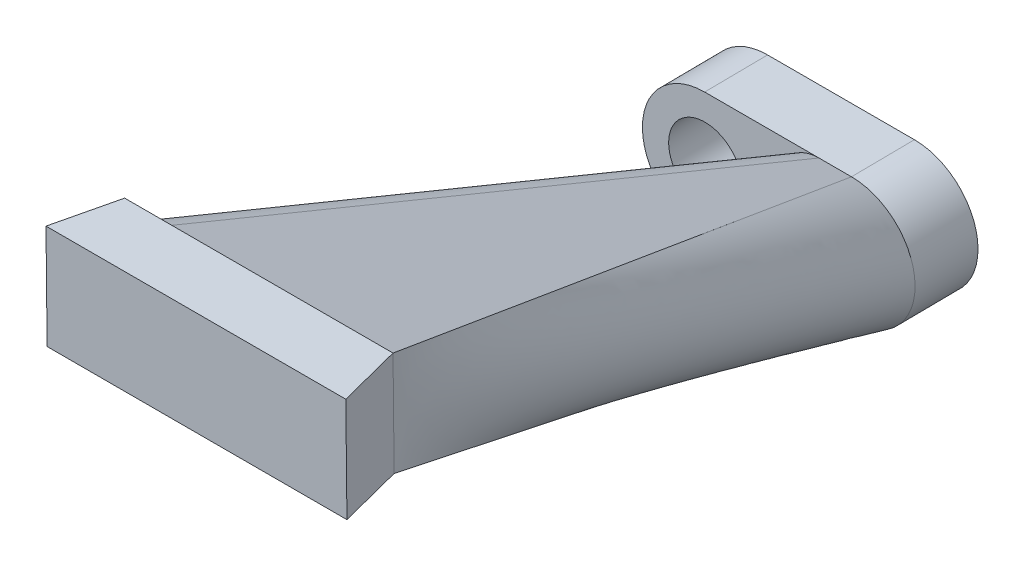
ISO-10303-21;
HEADER;
FILE_DESCRIPTION(('STEP AP214'),'2;1');
FILE_NAME('part.step','',(''),(''),'','','');
FILE_SCHEMA(('AUTOMOTIVE_DESIGN { 1 0 10303 214 1 1 1 1 }'));
ENDSEC;
DATA;
#1=APPLICATION_CONTEXT('core data for automotive mechanical design processes');
#2=APPLICATION_PROTOCOL_DEFINITION('international standard','automotive_design',2000,#1);
#3=PRODUCT_CONTEXT('',#1,'mechanical');
#4=PRODUCT('Part','Part','',(#3));
#5=PRODUCT_RELATED_PRODUCT_CATEGORY('part','',(#4));
#6=PRODUCT_DEFINITION_FORMATION('','',#4);
#7=PRODUCT_DEFINITION_CONTEXT('part definition',#1,'design');
#8=PRODUCT_DEFINITION('design','',#6,#7);
#9=PRODUCT_DEFINITION_SHAPE('','',#8);
#10=(LENGTH_UNIT() NAMED_UNIT(*) SI_UNIT(.MILLI.,.METRE.));
#11=(NAMED_UNIT(*) PLANE_ANGLE_UNIT() SI_UNIT($,.RADIAN.));
#12=(NAMED_UNIT(*) SI_UNIT($,.STERADIAN.) SOLID_ANGLE_UNIT());
#13=UNCERTAINTY_MEASURE_WITH_UNIT(LENGTH_MEASURE(1.E-05),#10,'distance_accuracy_value','');
#14=(GEOMETRIC_REPRESENTATION_CONTEXT(3) GLOBAL_UNCERTAINTY_ASSIGNED_CONTEXT((#13)) GLOBAL_UNIT_ASSIGNED_CONTEXT((#10,
#11,#12)) REPRESENTATION_CONTEXT('',''));
#15=CARTESIAN_POINT('',(0.,0.,0.));
#16=DIRECTION('',(0.,0.,1.));
#17=DIRECTION('',(1.,0.,0.));
#18=AXIS2_PLACEMENT_3D('',#15,#16,#17);
#19=CARTESIAN_POINT('',(83.3410313790949,-3.38593298130903,-20.8732078604044));
#20=DIRECTION('',(-0.970139338542733,-0.002552998259323,0.24253483463568));
#21=DIRECTION('',(0.24253562503633,0.,0.970142500145333));
#22=AXIS2_PLACEMENT_3D('',#19,#20,#21);
#23=PLANE('',#22);
#24=DIRECTION('',(0.242548271096433,-0.0102114273229164,0.970085595677083));
#25=VECTOR('',#24,1.);
#26=CARTESIAN_POINT('',(83.3410313790949,1.61379003339868,-20.8205791970917));
#27=LINE('',#26,#25);
#28=CARTESIAN_POINT('',(109.497742940186,0.512576827857516,83.7946753293208));
#29=VERTEX_POINT('',#28);
#30=CARTESIAN_POINT('',(110.247784490282,0.480999629869888,86.7945091381455));
#31=VERTEX_POINT('',#30);
#32=EDGE_CURVE('E200',#29,#31,#27,.T.);
#33=ORIENTED_EDGE('',*,*,#32,.T.);
#34=DIRECTION('',(0.,0.999944602941541,0.0105257326625423));
#35=VECTOR('',#34,1.);
#36=CARTESIAN_POINT('',(110.247784490282,-4.51872338483782,86.7418804748328));
#37=LINE('',#36,#35);
#38=CARTESIAN_POINT('',(110.247784490282,-4.51872338483782,86.7418804748328));
#39=VERTEX_POINT('',#38);
#40=EDGE_CURVE('E196',#39,#31,#37,.T.);
#41=ORIENTED_EDGE('',*,*,#40,.F.);
#42=DIRECTION('',(0.242548271096433,-0.0102114273229164,0.970085595677083));
#43=VECTOR('',#42,1.);
#44=CARTESIAN_POINT('',(83.3410313790949,-3.38593298130903,-20.8732078604044));
#45=LINE('',#44,#43);
#46=CARTESIAN_POINT('',(109.497742940186,-4.48714618685019,83.7420466660081));
#47=VERTEX_POINT('',#46);
#48=EDGE_CURVE('E397',#47,#39,#45,.T.);
#49=ORIENTED_EDGE('',*,*,#48,.F.);
#50=DIRECTION('',(0.,0.999944602941541,0.0105257326625419));
#51=VECTOR('',#50,1.);
#52=CARTESIAN_POINT('',(109.497742940186,-4.48714618685019,83.7420466660081));
#53=LINE('',#52,#51);
#54=EDGE_CURVE('E395',#47,#29,#53,.T.);
#55=ORIENTED_EDGE('',*,*,#54,.T.);
#56=EDGE_LOOP('',(#33,#41,#49,#55));
#57=FACE_BOUND('',#56,.T.);
#58=ADVANCED_FACE('F91',(#57),#23,.F.);
#59=CARTESIAN_POINT('',(0.,-4.51872338483783,86.7418804748327));
#60=DIRECTION('',(0.,0.0105257326625423,-0.999944602941541));
#61=DIRECTION('',(0.,0.999944602941541,0.0105257326625423));
#62=AXIS2_PLACEMENT_3D('',#59,#60,#61);
#63=PLANE('',#62);
#64=DIRECTION('',(-1.,0.,0.));
#65=VECTOR('',#64,1.);
#66=CARTESIAN_POINT('',(0.,0.480999629869876,86.7945091381454));
#67=LINE('',#66,#65);
#68=CARTESIAN_POINT('',(95.9522155097186,0.480999629869887,86.7945091381455));
#69=VERTEX_POINT('',#68);
#70=EDGE_CURVE('E189',#31,#69,#67,.T.);
#71=ORIENTED_EDGE('',*,*,#70,.T.);
#72=DIRECTION('',(0.,0.999944602941541,0.0105257326625419));
#73=VECTOR('',#72,1.);
#74=CARTESIAN_POINT('',(95.9522155097186,-4.51872338483782,86.7418804748328));
#75=LINE('',#74,#73);
#76=CARTESIAN_POINT('',(95.9522155097186,-4.51872338483782,86.7418804748328));
#77=VERTEX_POINT('',#76);
#78=EDGE_CURVE('E194',#77,#69,#75,.T.);
#79=ORIENTED_EDGE('',*,*,#78,.F.);
#80=DIRECTION('',(-1.,0.,0.));
#81=VECTOR('',#80,1.);
#82=CARTESIAN_POINT('',(0.,-4.51872338483783,86.7418804748327));
#83=LINE('',#82,#81);
#84=EDGE_CURVE('E393',#39,#77,#83,.T.);
#85=ORIENTED_EDGE('',*,*,#84,.F.);
#86=ORIENTED_EDGE('',*,*,#40,.T.);
#87=EDGE_LOOP('',(#71,#79,#85,#86));
#88=FACE_BOUND('',#87,.T.);
#89=ADVANCED_FACE('F191',(#88),#63,.F.);
#90=CARTESIAN_POINT('',(0.,-3.60525148493823,-0.037950015630928));
#91=DIRECTION('',(0.,-0.999944602941541,-0.0105257326625423));
#92=DIRECTION('',(0.,0.0105257326625423,-0.999944602941541));
#93=AXIS2_PLACEMENT_3D('',#90,#91,#92);
#94=PLANE('',#93);
#95=DIRECTION('',(1.,0.,0.));
#96=VECTOR('',#95,1.);
#97=CARTESIAN_POINT('',(99.4479935520343,-4.48714618685019,83.7420466660082));
#98=LINE('',#97,#96);
#99=CARTESIAN_POINT('',(99.0747814196377,-4.48714618685019,83.7420466660082));
#100=VERTEX_POINT('',#99);
#101=EDGE_CURVE('E199',#47,#100,#98,.F.);
#102=ORIENTED_EDGE('',*,*,#101,.F.);
#103=ORIENTED_EDGE('',*,*,#48,.T.);
#104=ORIENTED_EDGE('',*,*,#84,.T.);
#105=DIRECTION('',(-0.242548271096444,-0.0102114273229171,0.97008559567708));
#106=VECTOR('',#105,1.);
#107=CARTESIAN_POINT('',(96.7022570598142,-4.48714618685019,83.7420466660082));
#108=LINE('',#107,#106);
#109=CARTESIAN_POINT('',(96.7022570598142,-4.48714618685019,83.7420466660082));
#110=VERTEX_POINT('',#109);
#111=EDGE_CURVE('E213',#110,#77,#108,.T.);
#112=ORIENTED_EDGE('',*,*,#111,.F.);
#113=DIRECTION('',(1.,0.,0.));
#114=VECTOR('',#113,1.);
#115=CARTESIAN_POINT('',(96.7022570598142,-4.48714618685019,83.7420466660082));
#116=LINE('',#115,#114);
#117=EDGE_CURVE('E109',#110,#100,#116,.T.);
#118=ORIENTED_EDGE('',*,*,#117,.T.);
#119=EDGE_LOOP('',(#102,#103,#104,#112,#118));
#120=FACE_BOUND('',#119,.T.);
#121=ADVANCED_FACE('F354',(#120),#94,.T.);
#122=CARTESIAN_POINT('',(0.,1.39447152976948,0.0146786476817837));
#123=DIRECTION('',(0.,-0.999944602941541,-0.0105257326625423));
#124=DIRECTION('',(0.,0.0105257326625423,-0.999944602941541));
#125=AXIS2_PLACEMENT_3D('',#122,#123,#124);
#126=PLANE('',#125);
#127=DIRECTION('',(1.,0.,0.));
#128=VECTOR('',#127,1.);
#129=CARTESIAN_POINT('',(0.,0.512576827857503,83.7946753293208));
#130=LINE('',#129,#128);
#131=CARTESIAN_POINT('',(98.9495876002193,0.512576827857514,83.7946753293208));
#132=VERTEX_POINT('',#131);
#133=EDGE_CURVE('E404',#29,#132,#130,.F.);
#134=ORIENTED_EDGE('',*,*,#133,.T.);
#135=DIRECTION('',(1.,0.,0.));
#136=VECTOR('',#135,1.);
#137=CARTESIAN_POINT('',(96.7022570598142,0.512576827857512,83.7946753293209));
#138=LINE('',#137,#136);
#139=CARTESIAN_POINT('',(96.7022570598142,0.512576827857512,83.7946753293209));
#140=VERTEX_POINT('',#139);
#141=EDGE_CURVE('E206',#140,#132,#138,.T.);
#142=ORIENTED_EDGE('',*,*,#141,.F.);
#143=DIRECTION('',(0.242548271096444,0.0102114273229158,-0.97008559567708));
#144=VECTOR('',#143,1.);
#145=CARTESIAN_POINT('',(95.9522155097186,0.480999629869887,86.7945091381455));
#146=LINE('',#145,#144);
#147=EDGE_CURVE('E203',#69,#140,#146,.T.);
#148=ORIENTED_EDGE('',*,*,#147,.F.);
#149=ORIENTED_EDGE('',*,*,#70,.F.);
#150=ORIENTED_EDGE('',*,*,#32,.F.);
#151=EDGE_LOOP('',(#134,#142,#148,#149,#150));
#152=FACE_BOUND('',#151,.T.);
#153=ADVANCED_FACE('F205',(#152),#126,.F.);
#154=CARTESIAN_POINT('',(102.947993552034,-9.68896326867873,55.3857228731185));
#155=DIRECTION('',(0.,0.941158271494262,-0.33796613439505));
#156=DIRECTION('',(-1.,0.,0.));
#157=AXIS2_PLACEMENT_3D('',#154,#155,#156);
#158=PLANE('',#157);
#159=DIRECTION('',(-1.,0.,0.));
#160=VECTOR('',#159,1.);
#161=CARTESIAN_POINT('',(99.4479935520343,-9.68896326867873,55.3857228731185));
#162=LINE('',#161,#160);
#163=CARTESIAN_POINT('',(102.947993552034,-9.68896326867873,55.3857228731185));
#164=VERTEX_POINT('',#163);
#165=CARTESIAN_POINT('',(101.395324092439,-9.68896326867873,55.3857228731185));
#166=VERTEX_POINT('',#165);
#167=EDGE_CURVE('E246',#164,#166,#162,.T.);
#168=ORIENTED_EDGE('',*,*,#167,.T.);
#169=DIRECTION('',(-0.0807599787850204,0.336862194431635,0.938084051558999));
#170=VECTOR('',#169,1.);
#171=CARTESIAN_POINT('',(101.405450873089,-9.73120361598088,55.2680931812402));
#172=LINE('',#171,#170);
#173=EDGE_CURVE('E372',#166,#132,#172,.T.);
#174=ORIENTED_EDGE('',*,*,#173,.T.);
#175=ORIENTED_EDGE('',*,*,#133,.F.);
#176=CARTESIAN_POINT('',(102.947993552034,-9.68896326867873,55.3857228731185));
#177=CARTESIAN_POINT('',(105.131243348085,-6.28844990316665,64.8553736918526));
#178=CARTESIAN_POINT('',(107.314493144135,-2.88793653765457,74.3250245105867));
#179=CARTESIAN_POINT('',(109.497742940186,0.512576827857515,83.7946753293209));
#180=B_SPLINE_CURVE_WITH_KNOTS('',3,(#176,#177,#178,#179),.UNSPECIFIED.,.F.,.F.,(4,4),(0.,1.),.UNSPECIFIED.);
#181=EDGE_CURVE('E383',#164,#29,#180,.T.);
#182=ORIENTED_EDGE('',*,*,#181,.F.);
#183=EDGE_LOOP('',(#168,#174,#175,#182));
#184=FACE_BOUND('',#183,.T.);
#185=ADVANCED_FACE('F428',(#184),#158,.T.);
#186=CARTESIAN_POINT('',(102.947993552034,-15.688630886328,55.3225684771433));
#187=CARTESIAN_POINT('',(105.131243348085,-11.9548026531687,64.7957278734316));
#188=CARTESIAN_POINT('',(107.314493144135,-8.22097442000945,74.2688872697199));
#189=CARTESIAN_POINT('',(109.497742940186,-4.48714618685019,83.7420466660081));
#190=CARTESIAN_POINT('',(103.340692630599,-15.688630886328,55.3225684771433));
#191=CARTESIAN_POINT('',(105.393042733795,-11.8853620557422,64.7964588270887));
#192=CARTESIAN_POINT('',(107.44539283699,-8.08209322515646,74.2703491770341));
#193=CARTESIAN_POINT('',(109.497742940186,-4.2788243945707,83.7442395269795));
#194=CARTESIAN_POINT('',(104.125991313304,-15.5326096603819,55.3242108058375));
#195=CARTESIAN_POINT('',(105.916575188932,-11.6424667102585,64.7990156201991));
#196=CARTESIAN_POINT('',(107.707159064559,-7.75232376013513,74.2738204345606));
#197=CARTESIAN_POINT('',(109.497742940186,-3.86218081001173,83.7486252489222));
#198=CARTESIAN_POINT('',(105.124627613064,-14.8652503165816,55.3312356410353));
#199=CARTESIAN_POINT('',(106.582332722105,-10.9892386887789,64.8058917046356));
#200=CARTESIAN_POINT('',(108.040037831145,-7.11322706097606,74.2805477682359));
#201=CARTESIAN_POINT('',(109.497742940186,-3.23721543317327,83.7552038318363));
#202=CARTESIAN_POINT('',(105.79188128394,-13.866726208209,55.3417464211235));
#203=CARTESIAN_POINT('',(107.027168502688,-10.1152341575843,64.8150917523325));
#204=CARTESIAN_POINT('',(108.262455721437,-6.36374210695954,74.2884370835415));
#205=CARTESIAN_POINT('',(109.497742940186,-2.6122500563348,83.7617824147504));
#206=CARTESIAN_POINT('',(106.026205735813,-12.6887970775033,55.3541456751308));
#207=CARTESIAN_POINT('',(107.183384803937,-9.12162627816767,64.8255507826421));
#208=CARTESIAN_POINT('',(108.340563872061,-5.554455478832,74.2969558901533));
#209=CARTESIAN_POINT('',(109.497742940186,-1.98728467949634,83.7683609976646));
#210=CARTESIAN_POINT('',(105.791881283939,-11.5108679467977,55.3665449291384));
#211=CARTESIAN_POINT('',(107.027168502688,-8.12801839875108,64.8360098129518));
#212=CARTESIAN_POINT('',(108.262455721437,-4.74516885070447,74.3054746967652));
#213=CARTESIAN_POINT('',(109.497742940186,-1.36231930265787,83.7749395805786));
#214=CARTESIAN_POINT('',(105.124627613064,-10.5123438384251,55.3770557092264));
#215=CARTESIAN_POINT('',(106.582332722105,-7.25401386755651,64.8452098606484));
#216=CARTESIAN_POINT('',(108.040037831145,-3.99568389668796,74.3133640120705));
#217=CARTESIAN_POINT('',(109.497742940186,-0.737353925819412,83.7815181634926));
#218=CARTESIAN_POINT('',(104.125991313304,-9.84498449462477,55.3840805444244));
#219=CARTESIAN_POINT('',(105.916575188932,-6.60078584607683,64.8520859450852));
#220=CARTESIAN_POINT('',(107.707159064559,-3.35658719752889,74.320091345746));
#221=CARTESIAN_POINT('',(109.497742940186,-0.112388548980949,83.7880967464067));
#222=CARTESIAN_POINT('',(103.340692630599,-9.68896326867873,55.3857228731185));
#223=CARTESIAN_POINT('',(105.393042733795,-6.35789050059314,64.8546427381955));
#224=CARTESIAN_POINT('',(107.44539283699,-3.02681773250756,74.3235626032725));
#225=CARTESIAN_POINT('',(109.497742940186,0.304255035578027,83.7924824683495));
#226=CARTESIAN_POINT('',(102.947993552034,-9.68896326867873,55.3857228731185));
#227=CARTESIAN_POINT('',(105.131243348085,-6.28844990316665,64.8553736918526));
#228=CARTESIAN_POINT('',(107.314493144135,-2.88793653765457,74.3250245105867));
#229=CARTESIAN_POINT('',(109.497742940186,0.512576827857515,83.7946753293209));
#230=B_SPLINE_SURFACE_WITH_KNOTS('',3,3,((#186,#187,#188,#189),(#190,#191,#192,#193),(#194,#195,
#196,#197),(#198,#199,#200,#201),(#202,#203,#204,#205),(#206,#207,#208,#209),(#210,#211,#212,
#213),(#214,#215,#216,#217),(#218,#219,#220,#221),(#222,#223,#224,#225),(#226,#227,#228,#229)),
.UNSPECIFIED.,.F.,.F.,.F.,(4,1,1,1,1,1,1,1,4),(4,4),(0.461819265649355,0.497017897985986,
0.532216530322617,0.567415162659249,0.60261379499588,0.637812427332512,0.673011059669143,
0.708209692005775,0.743408324342406),(0.,1.),.UNSPECIFIED.);
#231=CARTESIAN_POINT('',(102.947993552034,-12.6887970775034,55.3541456751309));
#232=DIRECTION('',(0.,-0.0105257326625423,0.999944602941541));
#233=DIRECTION('',(0.,-0.999944602941541,-0.0105257326625423));
#234=AXIS2_PLACEMENT_3D('',#231,#232,#233);
#235=CIRCLE('',#234,3.);
#236=CARTESIAN_POINT('',(102.947993552034,-15.688630886328,55.3225684771433));
#237=VERTEX_POINT('',#236);
#238=EDGE_CURVE('E253',#237,#164,#235,.T.);
#239=CARTESIAN_POINT('',(102.947993552034,-15.688630886328,55.3225684771433));
#240=CARTESIAN_POINT('',(105.131243348085,-11.9548026531687,64.7957278734316));
#241=CARTESIAN_POINT('',(107.314493144135,-8.22097442000945,74.2688872697199));
#242=CARTESIAN_POINT('',(109.497742940186,-4.48714618685019,83.7420466660081));
#243=B_SPLINE_CURVE_WITH_KNOTS('',3,(#239,#240,#241,#242),.UNSPECIFIED.,.F.,.F.,(4,4),(0.,1.),.UNSPECIFIED.);
#244=EDGE_CURVE('E380',#237,#47,#243,.T.);
#245=ORIENTED_EDGE('',*,*,#238,.T.);
#246=ORIENTED_EDGE('',*,*,#181,.T.);
#247=ORIENTED_EDGE('',*,*,#54,.F.);
#248=ORIENTED_EDGE('',*,*,#244,.F.);
#249=EDGE_LOOP('',(#245,#246,#247,#248));
#250=FACE_BOUND('',#249,.T.);
#251=ADVANCED_FACE('F436',(#250),#230,.T.);
#252=CARTESIAN_POINT('',(99.4479935520343,-15.688630886328,55.3225684771433));
#253=DIRECTION('',(0.,-0.930342147653002,0.366692634641602));
#254=DIRECTION('',(1.,0.,0.));
#255=AXIS2_PLACEMENT_3D('',#252,#253,#254);
#256=PLANE('',#255);
#257=ORIENTED_EDGE('',*,*,#101,.T.);
#258=DIRECTION('',(-0.0798084254407687,0.365522965907367,0.927374561125626));
#259=VECTOR('',#258,1.);
#260=CARTESIAN_POINT('',(101.507317206762,-15.6281715945678,55.4759607791095));
#261=LINE('',#260,#259);
#262=CARTESIAN_POINT('',(101.520517911858,-15.688630886328,55.3225684771433));
#263=VERTEX_POINT('',#262);
#264=EDGE_CURVE('E303',#100,#263,#261,.F.);
#265=ORIENTED_EDGE('',*,*,#264,.T.);
#266=DIRECTION('',(1.,0.,0.));
#267=VECTOR('',#266,1.);
#268=CARTESIAN_POINT('',(99.4479935520343,-15.688630886328,55.3225684771433));
#269=LINE('',#268,#267);
#270=EDGE_CURVE('E95',#263,#237,#269,.T.);
#271=ORIENTED_EDGE('',*,*,#270,.T.);
#272=ORIENTED_EDGE('',*,*,#244,.T.);
#273=EDGE_LOOP('',(#257,#265,#271,#272));
#274=FACE_BOUND('',#273,.T.);
#275=ADVANCED_FACE('F440',(#274),#256,.T.);
#276=CARTESIAN_POINT('',(99.4479935520343,-9.68896326867873,55.3857228731185));
#277=DIRECTION('',(-0.996286426455116,0.000906274534651452,-0.0860960807921161));
#278=DIRECTION('',(0.,-0.999944602941541,-0.0105257326625414));
#279=AXIS2_PLACEMENT_3D('',#276,#277,#278);
#280=PLANE('',#279);
#281=DIRECTION('',(0.,-0.999944602941541,-0.0105257326625414));
#282=VECTOR('',#281,1.);
#283=CARTESIAN_POINT('',(97.0022570598142,-9.98684150302866,83.6841551363642));
#284=LINE('',#283,#282);
#285=CARTESIAN_POINT('',(97.0022570598141,-2.25847106274648,83.7655064041566));
#286=VERTEX_POINT('',#285);
#287=CARTESIAN_POINT('',(97.0022570598141,-1.55663975490705,83.7728941021338));
#288=VERTEX_POINT('',#287);
#289=EDGE_CURVE('E391',#286,#288,#284,.F.);
#290=ORIENTED_EDGE('',*,*,#289,.T.);
#291=DIRECTION('',(-0.0807599787850204,0.336862194431635,0.938084051558999));
#292=VECTOR('',#291,1.);
#293=CARTESIAN_POINT('',(99.3900504105716,-11.5164901670349,56.0369920568047));
#294=LINE('',#293,#292);
#295=CARTESIAN_POINT('',(99.4479935520343,-11.7581798514433,55.3639416459315));
#296=VERTEX_POINT('',#295);
#297=EDGE_CURVE('E307',#288,#296,#294,.F.);
#298=ORIENTED_EDGE('',*,*,#297,.T.);
#299=DIRECTION('',(0.,-0.999944602941541,-0.0105257326625426));
#300=VECTOR('',#299,1.);
#301=CARTESIAN_POINT('',(99.4479935520343,-9.68896326867873,55.3857228731185));
#302=LINE('',#301,#300);
#303=CARTESIAN_POINT('',(99.4479935520343,-13.4599557622243,55.3460282152917));
#304=VERTEX_POINT('',#303);
#305=EDGE_CURVE('E376',#296,#304,#302,.T.);
#306=ORIENTED_EDGE('',*,*,#305,.T.);
#307=DIRECTION('',(-0.0798084254407687,0.365522965907367,0.927374561125626));
#308=VECTOR('',#307,1.);
#309=CARTESIAN_POINT('',(99.3350489734951,-12.9426690584359,56.6584451484138));
#310=LINE('',#309,#308);
#311=EDGE_CURVE('E388',#304,#286,#310,.T.);
#312=ORIENTED_EDGE('',*,*,#311,.T.);
#313=EDGE_LOOP('',(#290,#298,#306,#312));
#314=FACE_BOUND('',#313,.T.);
#315=ADVANCED_FACE('F337',(#314),#280,.T.);
#316=CARTESIAN_POINT('',(95.9479935520343,-12.6887970775034,55.3541456751309));
#317=DIRECTION('',(0.,-0.0105257326625423,0.999944602941541));
#318=DIRECTION('',(0.,-0.999944602941541,-0.0105257326625423));
#319=AXIS2_PLACEMENT_3D('',#316,#317,#318);
#320=PLANE('',#319);
#321=DIRECTION('',(1.,0.,0.));
#322=VECTOR('',#321,1.);
#323=CARTESIAN_POINT('',(95.9479935520343,-15.688630886328,55.3225684771433));
#324=LINE('',#323,#322);
#325=CARTESIAN_POINT('',(95.9479935520343,-15.688630886328,55.3225684771433));
#326=VERTEX_POINT('',#325);
#327=CARTESIAN_POINT('',(99.4479935520343,-15.688630886328,55.3225684771433));
#328=VERTEX_POINT('',#327);
#329=EDGE_CURVE('E230',#326,#328,#324,.T.);
#330=ORIENTED_EDGE('',*,*,#329,.T.);
#331=CARTESIAN_POINT('',(99.4479935520343,-15.688630886328,55.3225684771433));
#332=DIRECTION('',(1.,0.,0.));
#333=VECTOR('',#332,1.);
#334=LINE('',#331,#333);
#335=EDGE_CURVE('E322',#328,#263,#334,.T.);
#336=ORIENTED_EDGE('',*,*,#335,.T.);
#337=CARTESIAN_POINT('',(101.455448383188,-13.52992784202,55.3452916670834));
#338=DIRECTION('',(0.,-0.0105257326625423,0.999944602941541));
#339=DIRECTION('',(-0.208020412743924,0.978070299640327,0.010295476838319));
#340=AXIS2_PLACEMENT_3D('',#337,#338,#339);
#341=ELLIPSE('',#340,2.16573084107591,2.);
#342=EDGE_CURVE('E13',#263,#304,#341,.F.);
#343=ORIENTED_EDGE('',*,*,#342,.T.);
#344=ORIENTED_EDGE('',*,*,#305,.F.);
#345=CARTESIAN_POINT('',(101.455448383188,-11.8220674025611,55.3632691453935));
#346=DIRECTION('',(0.,-0.0105257326625423,0.999944602941541));
#347=DIRECTION('',(-0.226854555639595,0.973874694802167,0.0102513125768647));
#348=AXIS2_PLACEMENT_3D('',#345,#346,#347);
#349=ELLIPSE('',#348,2.14021314709457,2.);
#350=EDGE_CURVE('E311',#296,#166,#349,.F.);
#351=ORIENTED_EDGE('',*,*,#350,.T.);
#352=DIRECTION('',(-1.,0.,0.));
#353=VECTOR('',#352,1.);
#354=CARTESIAN_POINT('',(95.9479935520343,-9.68896326867873,55.3857228731185));
#355=LINE('',#354,#353);
#356=CARTESIAN_POINT('',(95.9479935520343,-9.68896326867873,55.3857228731185));
#357=VERTEX_POINT('',#356);
#358=EDGE_CURVE('E117',#166,#357,#355,.T.);
#359=ORIENTED_EDGE('',*,*,#358,.T.);
#360=CARTESIAN_POINT('',(95.9479935520343,-12.6887970775034,55.3541456751309));
#361=DIRECTION('',(0.,-0.0105257326625423,0.999944602941541));
#362=DIRECTION('',(0.,-0.999944602941541,-0.0105257326625423));
#363=AXIS2_PLACEMENT_3D('',#360,#361,#362);
#364=CIRCLE('',#363,3.);
#365=EDGE_CURVE('E227',#357,#326,#364,.T.);
#366=ORIENTED_EDGE('',*,*,#365,.T.);
#367=EDGE_LOOP('',(#330,#336,#343,#344,#351,#359,#366));
#368=FACE_BOUND('',#367,.T.);
#369=CARTESIAN_POINT('',(95.9479935520343,-12.6887970775034,55.3541456751309));
#370=DIRECTION('',(0.,-0.0105257326625423,0.999944602941541));
#371=DIRECTION('',(0.,-0.999944602941541,-0.0105257326625423));
#372=AXIS2_PLACEMENT_3D('',#369,#370,#371);
#373=CIRCLE('',#372,1.75000000000001);
#374=CARTESIAN_POINT('',(95.9479935520343,-14.4387001326511,55.3357256429715));
#375=VERTEX_POINT('',#374);
#376=EDGE_CURVE('E221',#375,#375,#373,.T.);
#377=ORIENTED_EDGE('',*,*,#376,.F.);
#378=EDGE_LOOP('',(#377));
#379=FACE_BOUND('',#378,.T.);
#380=ADVANCED_FACE('F327',(#368,#379),#320,.T.);
#381=CARTESIAN_POINT('',(95.9479935520343,-12.6572198795157,52.3543118663063));
#382=DIRECTION('',(0.,-0.0105257326625423,0.999944602941541));
#383=DIRECTION('',(0.,-0.999944602941541,-0.0105257326625423));
#384=AXIS2_PLACEMENT_3D('',#381,#382,#383);
#385=PLANE('',#384);
#386=CARTESIAN_POINT('',(95.9479935520343,-12.6572198795157,52.3543118663063));
#387=DIRECTION('',(0.,-0.0105257326625423,0.999944602941541));
#388=DIRECTION('',(0.,-0.999944602941541,-0.0105257326625423));
#389=AXIS2_PLACEMENT_3D('',#386,#387,#388);
#390=CIRCLE('',#389,3.);
#391=CARTESIAN_POINT('',(95.9479935520343,-9.6573860706911,52.3858890642939));
#392=VERTEX_POINT('',#391);
#393=CARTESIAN_POINT('',(95.9479935520343,-15.6570536883403,52.3227346683187));
#394=VERTEX_POINT('',#393);
#395=EDGE_CURVE('E224',#392,#394,#390,.T.);
#396=ORIENTED_EDGE('',*,*,#395,.F.);
#397=DIRECTION('',(-1.,0.,0.));
#398=VECTOR('',#397,1.);
#399=CARTESIAN_POINT('',(95.9479935520343,-9.6573860706911,52.3858890642939));
#400=LINE('',#399,#398);
#401=CARTESIAN_POINT('',(102.947993552034,-9.6573860706911,52.3858890642939));
#402=VERTEX_POINT('',#401);
#403=EDGE_CURVE('E231',#402,#392,#400,.T.);
#404=ORIENTED_EDGE('',*,*,#403,.F.);
#405=CARTESIAN_POINT('',(102.947993552034,-12.6572198795157,52.3543118663063));
#406=DIRECTION('',(0.,-0.0105257326625423,0.999944602941541));
#407=DIRECTION('',(0.,-0.999944602941541,-0.0105257326625423));
#408=AXIS2_PLACEMENT_3D('',#405,#406,#407);
#409=CIRCLE('',#408,3.);
#410=CARTESIAN_POINT('',(102.947993552034,-15.6570536883403,52.3227346683187));
#411=VERTEX_POINT('',#410);
#412=EDGE_CURVE('E236',#411,#402,#409,.T.);
#413=ORIENTED_EDGE('',*,*,#412,.F.);
#414=DIRECTION('',(1.,0.,0.));
#415=VECTOR('',#414,1.);
#416=CARTESIAN_POINT('',(95.9479935520343,-15.6570536883403,52.3227346683187));
#417=LINE('',#416,#415);
#418=EDGE_CURVE('E234',#394,#411,#417,.T.);
#419=ORIENTED_EDGE('',*,*,#418,.F.);
#420=EDGE_LOOP('',(#396,#404,#413,#419));
#421=FACE_BOUND('',#420,.T.);
#422=CARTESIAN_POINT('',(95.9479935520343,-12.6572198795157,52.3543118663063));
#423=DIRECTION('',(0.,-0.0105257326625423,0.999944602941541));
#424=DIRECTION('',(0.,-0.999944602941541,-0.0105257326625423));
#425=AXIS2_PLACEMENT_3D('',#422,#423,#424);
#426=CIRCLE('',#425,1.75000000000001);
#427=CARTESIAN_POINT('',(95.9479935520343,-14.4071229346634,52.3358918341468));
#428=VERTEX_POINT('',#427);
#429=EDGE_CURVE('E220',#428,#428,#426,.T.);
#430=ORIENTED_EDGE('',*,*,#429,.T.);
#431=EDGE_LOOP('',(#430));
#432=FACE_BOUND('',#431,.T.);
#433=ADVANCED_FACE('F336',(#421,#432),#385,.F.);
#434=CARTESIAN_POINT('',(95.9479935520343,-12.6887970775034,55.3541456751309));
#435=DIRECTION('',(0.,0.0105257326625423,-0.999944602941541));
#436=DIRECTION('',(0.,0.999944602941541,0.0105257326625423));
#437=AXIS2_PLACEMENT_3D('',#434,#435,#436);
#438=CYLINDRICAL_SURFACE('',#437,3.);
#439=ORIENTED_EDGE('',*,*,#395,.T.);
#440=DIRECTION('',(0.,0.0105257326625423,-0.999944602941541));
#441=VECTOR('',#440,1.);
#442=CARTESIAN_POINT('',(95.9479935520343,-15.688630886328,55.3225684771433));
#443=LINE('',#442,#441);
#444=EDGE_CURVE('E243',#326,#394,#443,.T.);
#445=ORIENTED_EDGE('',*,*,#444,.F.);
#446=ORIENTED_EDGE('',*,*,#365,.F.);
#447=DIRECTION('',(0.,0.0105257326625423,-0.999944602941541));
#448=VECTOR('',#447,1.);
#449=CARTESIAN_POINT('',(95.9479935520343,-9.68896326867873,55.3857228731185));
#450=LINE('',#449,#448);
#451=EDGE_CURVE('E239',#357,#392,#450,.T.);
#452=ORIENTED_EDGE('',*,*,#451,.T.);
#453=EDGE_LOOP('',(#439,#445,#446,#452));
#454=FACE_BOUND('',#453,.T.);
#455=ADVANCED_FACE('F277',(#454),#438,.T.);
#456=CARTESIAN_POINT('',(95.9479935520343,-15.688630886328,55.3225684771433));
#457=DIRECTION('',(0.,0.999944602941541,0.0105257326625423));
#458=DIRECTION('',(0.,-0.0105257326625423,0.999944602941541));
#459=AXIS2_PLACEMENT_3D('',#456,#457,#458);
#460=PLANE('',#459);
#461=ORIENTED_EDGE('',*,*,#418,.T.);
#462=DIRECTION('',(0.,0.0105257326625423,-0.999944602941541));
#463=VECTOR('',#462,1.);
#464=CARTESIAN_POINT('',(102.947993552034,-15.688630886328,55.3225684771433));
#465=LINE('',#464,#463);
#466=EDGE_CURVE('E247',#237,#411,#465,.T.);
#467=ORIENTED_EDGE('',*,*,#466,.F.);
#468=ORIENTED_EDGE('',*,*,#270,.F.);
#469=ORIENTED_EDGE('',*,*,#335,.F.);
#470=ORIENTED_EDGE('',*,*,#329,.F.);
#471=ORIENTED_EDGE('',*,*,#444,.T.);
#472=EDGE_LOOP('',(#461,#467,#468,#469,#470,#471));
#473=FACE_BOUND('',#472,.T.);
#474=ADVANCED_FACE('F271',(#473),#460,.F.);
#475=CARTESIAN_POINT('',(102.947993552034,-12.6887970775034,55.3541456751309));
#476=DIRECTION('',(0.,0.0105257326625423,-0.999944602941541));
#477=DIRECTION('',(0.,0.999944602941541,0.0105257326625423));
#478=AXIS2_PLACEMENT_3D('',#475,#476,#477);
#479=CYLINDRICAL_SURFACE('',#478,3.);
#480=ORIENTED_EDGE('',*,*,#412,.T.);
#481=DIRECTION('',(0.,0.0105257326625423,-0.999944602941541));
#482=VECTOR('',#481,1.);
#483=CARTESIAN_POINT('',(102.947993552034,-9.68896326867873,55.3857228731185));
#484=LINE('',#483,#482);
#485=EDGE_CURVE('E242',#164,#402,#484,.T.);
#486=ORIENTED_EDGE('',*,*,#485,.F.);
#487=ORIENTED_EDGE('',*,*,#238,.F.);
#488=ORIENTED_EDGE('',*,*,#466,.T.);
#489=EDGE_LOOP('',(#480,#486,#487,#488));
#490=FACE_BOUND('',#489,.T.);
#491=ADVANCED_FACE('F260',(#490),#479,.T.);
#492=CARTESIAN_POINT('',(95.9479935520343,-9.68896326867873,55.3857228731185));
#493=DIRECTION('',(0.,-0.999944602941541,-0.0105257326625423));
#494=DIRECTION('',(0.,0.0105257326625423,-0.999944602941541));
#495=AXIS2_PLACEMENT_3D('',#492,#493,#494);
#496=PLANE('',#495);
#497=ORIENTED_EDGE('',*,*,#403,.T.);
#498=ORIENTED_EDGE('',*,*,#451,.F.);
#499=ORIENTED_EDGE('',*,*,#358,.F.);
#500=ORIENTED_EDGE('',*,*,#167,.F.);
#501=ORIENTED_EDGE('',*,*,#485,.T.);
#502=EDGE_LOOP('',(#497,#498,#499,#500,#501));
#503=FACE_BOUND('',#502,.T.);
#504=ADVANCED_FACE('F270',(#503),#496,.F.);
#505=CARTESIAN_POINT('',(95.9479935520343,-12.6887970775034,55.3541456751309));
#506=DIRECTION('',(0.,0.0105257326625423,-0.999944602941541));
#507=DIRECTION('',(0.,0.999944602941541,0.0105257326625423));
#508=AXIS2_PLACEMENT_3D('',#505,#506,#507);
#509=CYLINDRICAL_SURFACE('',#508,1.75000000000001);
#510=ORIENTED_EDGE('',*,*,#376,.T.);
#511=EDGE_LOOP('',(#510));
#512=FACE_BOUND('',#511,.T.);
#513=ORIENTED_EDGE('',*,*,#429,.F.);
#514=EDGE_LOOP('',(#513));
#515=FACE_BOUND('',#514,.T.);
#516=ADVANCED_FACE('F338',(#512,#515),#509,.F.);
#517=CARTESIAN_POINT('',(96.7022570598142,0.512576827857512,83.7946753293209));
#518=DIRECTION('',(0.,-0.0105257326625419,0.999944602941541));
#519=DIRECTION('',(0.,-0.999944602941541,-0.0105257326625419));
#520=AXIS2_PLACEMENT_3D('',#517,#518,#519);
#521=PLANE('',#520);
#522=ORIENTED_EDGE('',*,*,#289,.F.);
#523=CARTESIAN_POINT('',(99.0097118909677,-2.32844314254217,83.7647698559482));
#524=DIRECTION('',(0.,-0.0105257326625419,0.999944602941541));
#525=DIRECTION('',(-0.208020412743922,0.978070299640328,0.0102954768383184));
#526=AXIS2_PLACEMENT_3D('',#523,#524,#525);
#527=ELLIPSE('',#526,2.16573084107591,2.);
#528=EDGE_CURVE('E101',#286,#100,#527,.T.);
#529=ORIENTED_EDGE('',*,*,#528,.T.);
#530=ORIENTED_EDGE('',*,*,#117,.F.);
#531=DIRECTION('',(0.,-0.999944602941541,-0.0105257326625419));
#532=VECTOR('',#531,1.);
#533=CARTESIAN_POINT('',(96.7022570598142,0.512576827857512,83.7946753293209));
#534=LINE('',#533,#532);
#535=EDGE_CURVE('E209',#140,#110,#534,.T.);
#536=ORIENTED_EDGE('',*,*,#535,.F.);
#537=ORIENTED_EDGE('',*,*,#141,.T.);
#538=CARTESIAN_POINT('',(99.0097118909677,-1.62052730602485,83.7722216015958));
#539=DIRECTION('',(0.,-0.0105257326625419,0.999944602941541));
#540=DIRECTION('',(-0.226854555639592,0.973874694802167,0.010251312576864));
#541=AXIS2_PLACEMENT_3D('',#538,#539,#540);
#542=ELLIPSE('',#541,2.14021314709457,2.);
#543=EDGE_CURVE('E306',#132,#288,#542,.T.);
#544=ORIENTED_EDGE('',*,*,#543,.T.);
#545=EDGE_LOOP('',(#522,#529,#530,#536,#537,#544));
#546=FACE_BOUND('',#545,.T.);
#547=ADVANCED_FACE('F365',(#546),#521,.F.);
#548=CARTESIAN_POINT('',(110.710643043755,-0.292133271167768,27.7526607609397));
#549=DIRECTION('',(-0.97013933854273,0.0025529982593229,-0.242534834635691));
#550=DIRECTION('',(-0.242535625036341,0.,0.97014250014533));
#551=AXIS2_PLACEMENT_3D('',#548,#549,#550);
#552=PLANE('',#551);
#553=ORIENTED_EDGE('',*,*,#78,.T.);
#554=ORIENTED_EDGE('',*,*,#147,.T.);
#555=ORIENTED_EDGE('',*,*,#535,.T.);
#556=ORIENTED_EDGE('',*,*,#111,.T.);
#557=EDGE_LOOP('',(#553,#554,#555,#556));
#558=FACE_BOUND('',#557,.T.);
#559=ADVANCED_FACE('F212',(#558),#552,.T.);
#560=CARTESIAN_POINT('',(101.405450873089,-11.6135201589694,55.9440254500303));
#561=DIRECTION('',(-0.0807599787850204,0.336862194431635,0.938084051558999));
#562=DIRECTION('',(0.,-0.941158271494262,0.33796613439505));
#563=AXIS2_PLACEMENT_3D('',#560,#561,#562);
#564=CYLINDRICAL_SURFACE('',#563,2.);
#565=ORIENTED_EDGE('',*,*,#350,.F.);
#566=ORIENTED_EDGE('',*,*,#297,.F.);
#567=ORIENTED_EDGE('',*,*,#543,.F.);
#568=ORIENTED_EDGE('',*,*,#173,.F.);
#569=EDGE_LOOP('',(#565,#566,#567,#568));
#570=FACE_BOUND('',#569,.T.);
#571=ADVANCED_FACE('F357',(#570),#564,.T.);
#572=CARTESIAN_POINT('',(101.327621826405,-12.9444816075052,56.830637309998));
#573=DIRECTION('',(-0.0798084254407687,0.365522965907367,0.927374561125626));
#574=DIRECTION('',(0.,-0.930342147653002,0.366692634641602));
#575=AXIS2_PLACEMENT_3D('',#572,#573,#574);
#576=CYLINDRICAL_SURFACE('',#575,2.);
#577=ORIENTED_EDGE('',*,*,#342,.F.);
#578=ORIENTED_EDGE('',*,*,#264,.F.);
#579=ORIENTED_EDGE('',*,*,#528,.F.);
#580=ORIENTED_EDGE('',*,*,#311,.F.);
#581=EDGE_LOOP('',(#577,#578,#579,#580));
#582=FACE_BOUND('',#581,.T.);
#583=ADVANCED_FACE('F93',(#582),#576,.T.);
#584=CLOSED_SHELL('',(#58,#89,#121,#153,#185,#251,#275,#315,#380,#433,#455,#474,#491,#504,#516,
#547,#559,#571,#583));
#585=MANIFOLD_SOLID_BREP('B2',#584);
#586=ADVANCED_BREP_SHAPE_REPRESENTATION('',(#18,#585),#14);
#587=SHAPE_DEFINITION_REPRESENTATION(#9,#586);
ENDSEC;
END-ISO-10303-21;
